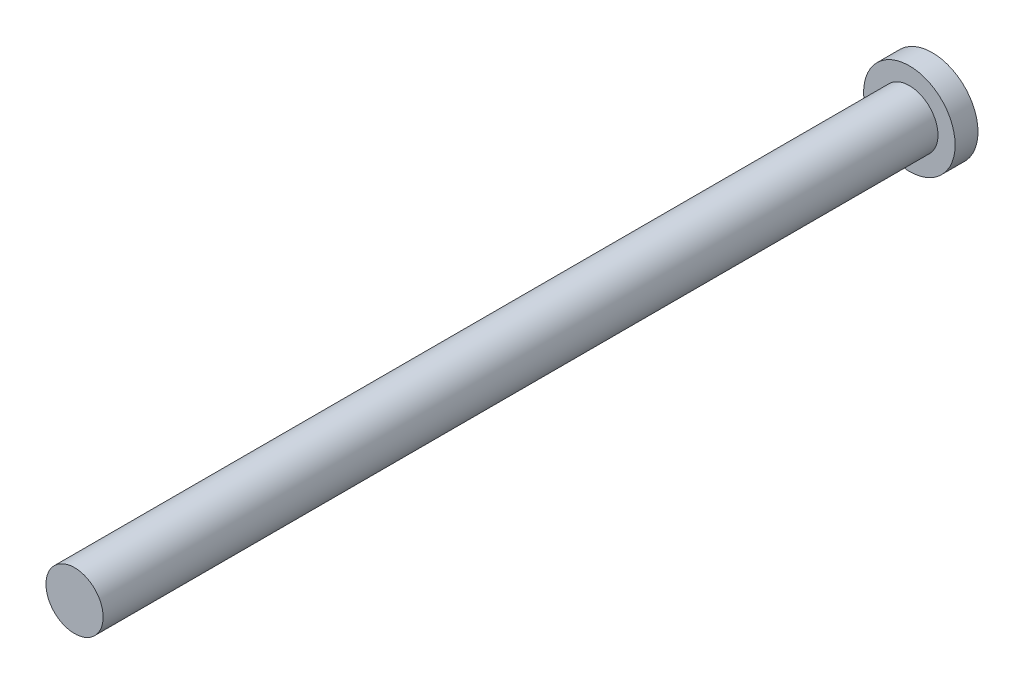
ISO-10303-21;
HEADER;
FILE_DESCRIPTION(('STEP AP214'),'2;1');
FILE_NAME('part.step','',(''),(''),'','','');
FILE_SCHEMA(('AUTOMOTIVE_DESIGN { 1 0 10303 214 1 1 1 1 }'));
ENDSEC;
DATA;
#1=APPLICATION_CONTEXT('core data for automotive mechanical design processes');
#2=APPLICATION_PROTOCOL_DEFINITION('international standard','automotive_design',2000,#1);
#3=PRODUCT_CONTEXT('',#1,'mechanical');
#4=PRODUCT('Part','Part','',(#3));
#5=PRODUCT_RELATED_PRODUCT_CATEGORY('part','',(#4));
#6=PRODUCT_DEFINITION_FORMATION('','',#4);
#7=PRODUCT_DEFINITION_CONTEXT('part definition',#1,'design');
#8=PRODUCT_DEFINITION('design','',#6,#7);
#9=PRODUCT_DEFINITION_SHAPE('','',#8);
#10=(LENGTH_UNIT() NAMED_UNIT(*) SI_UNIT(.MILLI.,.METRE.));
#11=(NAMED_UNIT(*) PLANE_ANGLE_UNIT() SI_UNIT($,.RADIAN.));
#12=(NAMED_UNIT(*) SI_UNIT($,.STERADIAN.) SOLID_ANGLE_UNIT());
#13=UNCERTAINTY_MEASURE_WITH_UNIT(LENGTH_MEASURE(1.E-05),#10,'distance_accuracy_value','');
#14=(GEOMETRIC_REPRESENTATION_CONTEXT(3) GLOBAL_UNCERTAINTY_ASSIGNED_CONTEXT((#13)) GLOBAL_UNIT_ASSIGNED_CONTEXT((#10,
#11,#12)) REPRESENTATION_CONTEXT('',''));
#15=CARTESIAN_POINT('',(0.,0.,0.));
#16=DIRECTION('',(0.,0.,1.));
#17=DIRECTION('',(1.,0.,0.));
#18=AXIS2_PLACEMENT_3D('',#15,#16,#17);
#19=CARTESIAN_POINT('',(0.,0.,75.));
#20=DIRECTION('',(0.,0.,-1.));
#21=DIRECTION('',(-1.,0.,0.));
#22=AXIS2_PLACEMENT_3D('',#19,#20,#21);
#23=CYLINDRICAL_SURFACE('',#22,2.5);
#24=CARTESIAN_POINT('',(0.,0.,2.));
#25=DIRECTION('',(0.,0.,1.));
#26=DIRECTION('',(1.,0.,0.));
#27=AXIS2_PLACEMENT_3D('',#24,#25,#26);
#28=CIRCLE('',#27,2.5);
#29=CARTESIAN_POINT('',(2.5,0.,2.));
#30=VERTEX_POINT('',#29);
#31=EDGE_CURVE('E51',#30,#30,#28,.T.);
#32=ORIENTED_EDGE('',*,*,#31,.T.);
#33=EDGE_LOOP('',(#32));
#34=FACE_BOUND('',#33,.T.);
#35=CARTESIAN_POINT('',(0.,0.,75.));
#36=DIRECTION('',(0.,0.,1.));
#37=DIRECTION('',(1.,0.,0.));
#38=AXIS2_PLACEMENT_3D('',#35,#36,#37);
#39=CIRCLE('',#38,2.5);
#40=CARTESIAN_POINT('',(2.5,0.,75.));
#41=VERTEX_POINT('',#40);
#42=EDGE_CURVE('E10',#41,#41,#39,.T.);
#43=ORIENTED_EDGE('',*,*,#42,.F.);
#44=EDGE_LOOP('',(#43));
#45=FACE_BOUND('',#44,.T.);
#46=ADVANCED_FACE('F36',(#34,#45),#23,.T.);
#47=CARTESIAN_POINT('',(0.,0.,75.));
#48=DIRECTION('',(0.,0.,1.));
#49=DIRECTION('',(1.,0.,0.));
#50=AXIS2_PLACEMENT_3D('',#47,#48,#49);
#51=PLANE('',#50);
#52=ORIENTED_EDGE('',*,*,#42,.T.);
#53=EDGE_LOOP('',(#52));
#54=FACE_BOUND('',#53,.T.);
#55=ADVANCED_FACE('F61',(#54),#51,.T.);
#56=CARTESIAN_POINT('',(0.,0.,2.));
#57=DIRECTION('',(0.,0.,1.));
#58=DIRECTION('',(1.,0.,0.));
#59=AXIS2_PLACEMENT_3D('',#56,#57,#58);
#60=PLANE('',#59);
#61=CARTESIAN_POINT('',(0.,0.,2.));
#62=DIRECTION('',(0.,0.,1.));
#63=DIRECTION('',(1.,0.,0.));
#64=AXIS2_PLACEMENT_3D('',#61,#62,#63);
#65=CIRCLE('',#64,4.);
#66=CARTESIAN_POINT('',(4.,0.,2.));
#67=VERTEX_POINT('',#66);
#68=EDGE_CURVE('E42',#67,#67,#65,.T.);
#69=ORIENTED_EDGE('',*,*,#68,.T.);
#70=EDGE_LOOP('',(#69));
#71=FACE_BOUND('',#70,.T.);
#72=ORIENTED_EDGE('',*,*,#31,.F.);
#73=EDGE_LOOP('',(#72));
#74=FACE_BOUND('',#73,.T.);
#75=ADVANCED_FACE('F58',(#71,#74),#60,.T.);
#76=CARTESIAN_POINT('',(0.,0.,2.));
#77=DIRECTION('',(0.,0.,-1.));
#78=DIRECTION('',(-1.,0.,0.));
#79=AXIS2_PLACEMENT_3D('',#76,#77,#78);
#80=CYLINDRICAL_SURFACE('',#79,4.);
#81=ORIENTED_EDGE('',*,*,#68,.F.);
#82=EDGE_LOOP('',(#81));
#83=FACE_BOUND('',#82,.T.);
#84=CARTESIAN_POINT('',(0.,0.,0.));
#85=DIRECTION('',(0.,0.,1.));
#86=DIRECTION('',(1.,0.,0.));
#87=AXIS2_PLACEMENT_3D('',#84,#85,#86);
#88=CIRCLE('',#87,4.);
#89=CARTESIAN_POINT('',(4.,0.,0.));
#90=VERTEX_POINT('',#89);
#91=EDGE_CURVE('E46',#90,#90,#88,.T.);
#92=ORIENTED_EDGE('',*,*,#91,.T.);
#93=EDGE_LOOP('',(#92));
#94=FACE_BOUND('',#93,.T.);
#95=ADVANCED_FACE('F60',(#83,#94),#80,.T.);
#96=CARTESIAN_POINT('',(0.,0.,0.));
#97=DIRECTION('',(0.,0.,1.));
#98=DIRECTION('',(1.,0.,0.));
#99=AXIS2_PLACEMENT_3D('',#96,#97,#98);
#100=PLANE('',#99);
#101=ORIENTED_EDGE('',*,*,#91,.F.);
#102=EDGE_LOOP('',(#101));
#103=FACE_BOUND('',#102,.T.);
#104=ADVANCED_FACE('F67',(#103),#100,.F.);
#105=CLOSED_SHELL('',(#46,#55,#75,#95,#104));
#106=MANIFOLD_SOLID_BREP('B2',#105);
#107=ADVANCED_BREP_SHAPE_REPRESENTATION('',(#18,#106),#14);
#108=SHAPE_DEFINITION_REPRESENTATION(#9,#107);
ENDSEC;
END-ISO-10303-21;
